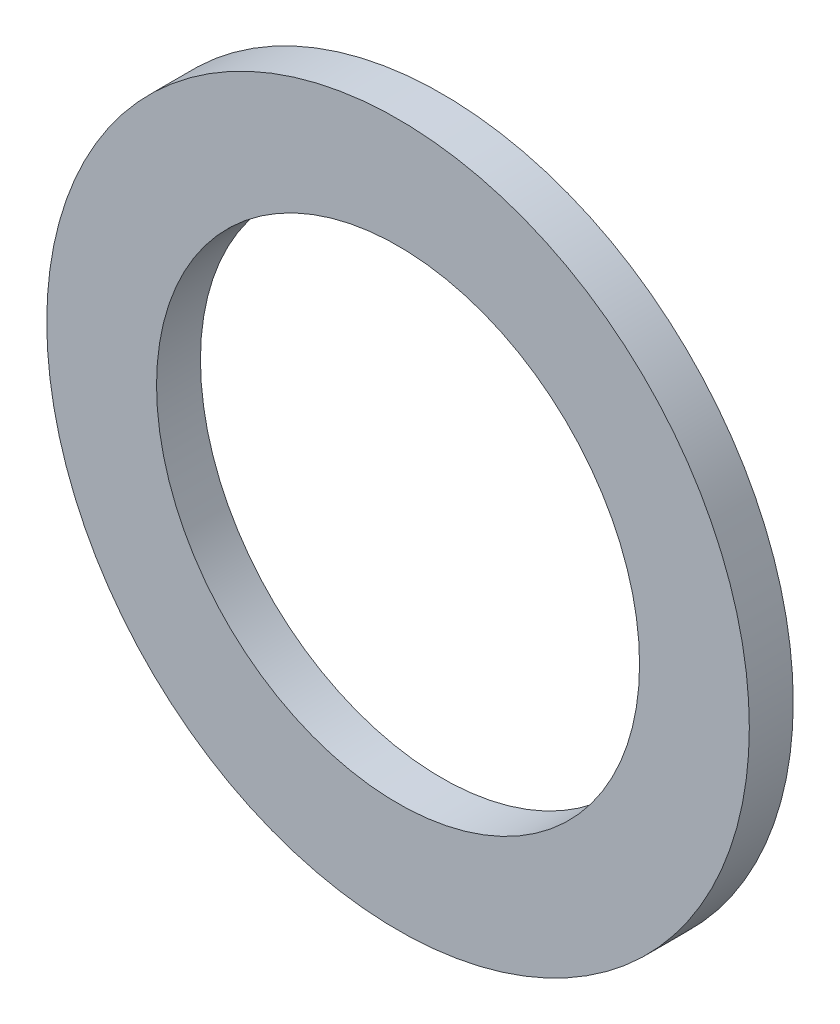
ISO-10303-21;
HEADER;
FILE_DESCRIPTION(('STEP AP214'),'2;1');
FILE_NAME('part.step','',(''),(''),'','','');
FILE_SCHEMA(('AUTOMOTIVE_DESIGN { 1 0 10303 214 1 1 1 1 }'));
ENDSEC;
DATA;
#1=APPLICATION_CONTEXT('core data for automotive mechanical design processes');
#2=APPLICATION_PROTOCOL_DEFINITION('international standard','automotive_design',2000,#1);
#3=PRODUCT_CONTEXT('',#1,'mechanical');
#4=PRODUCT('Part','Part','',(#3));
#5=PRODUCT_RELATED_PRODUCT_CATEGORY('part','',(#4));
#6=PRODUCT_DEFINITION_FORMATION('','',#4);
#7=PRODUCT_DEFINITION_CONTEXT('part definition',#1,'design');
#8=PRODUCT_DEFINITION('design','',#6,#7);
#9=PRODUCT_DEFINITION_SHAPE('','',#8);
#10=(LENGTH_UNIT() NAMED_UNIT(*) SI_UNIT(.MILLI.,.METRE.));
#11=(NAMED_UNIT(*) PLANE_ANGLE_UNIT() SI_UNIT($,.RADIAN.));
#12=(NAMED_UNIT(*) SI_UNIT($,.STERADIAN.) SOLID_ANGLE_UNIT());
#13=UNCERTAINTY_MEASURE_WITH_UNIT(LENGTH_MEASURE(1.E-05),#10,'distance_accuracy_value','');
#14=(GEOMETRIC_REPRESENTATION_CONTEXT(3) GLOBAL_UNCERTAINTY_ASSIGNED_CONTEXT((#13)) GLOBAL_UNIT_ASSIGNED_CONTEXT((#10,
#11,#12)) REPRESENTATION_CONTEXT('',''));
#15=CARTESIAN_POINT('',(0.,0.,0.));
#16=DIRECTION('',(0.,0.,1.));
#17=DIRECTION('',(1.,0.,0.));
#18=AXIS2_PLACEMENT_3D('',#15,#16,#17);
#19=CARTESIAN_POINT('',(0.,0.,1.));
#20=DIRECTION('',(0.,0.,1.));
#21=DIRECTION('',(1.,0.,0.));
#22=AXIS2_PLACEMENT_3D('',#19,#20,#21);
#23=PLANE('',#22);
#24=CARTESIAN_POINT('',(0.,0.,1.));
#25=DIRECTION('',(0.,0.,1.));
#26=DIRECTION('',(1.,0.,0.));
#27=AXIS2_PLACEMENT_3D('',#24,#25,#26);
#28=CIRCLE('',#27,8.);
#29=CARTESIAN_POINT('',(8.,0.,1.));
#30=VERTEX_POINT('',#29);
#31=EDGE_CURVE('E10',#30,#30,#28,.T.);
#32=ORIENTED_EDGE('',*,*,#31,.T.);
#33=EDGE_LOOP('',(#32));
#34=FACE_BOUND('',#33,.T.);
#35=CARTESIAN_POINT('',(0.,0.,1.));
#36=DIRECTION('',(0.,0.,1.));
#37=DIRECTION('',(1.,0.,0.));
#38=AXIS2_PLACEMENT_3D('',#35,#36,#37);
#39=CIRCLE('',#38,5.5);
#40=CARTESIAN_POINT('',(5.5,0.,1.));
#41=VERTEX_POINT('',#40);
#42=EDGE_CURVE('E42',#41,#41,#39,.T.);
#43=ORIENTED_EDGE('',*,*,#42,.F.);
#44=EDGE_LOOP('',(#43));
#45=FACE_BOUND('',#44,.T.);
#46=ADVANCED_FACE('F31',(#34,#45),#23,.T.);
#47=CARTESIAN_POINT('',(0.,0.,0.));
#48=DIRECTION('',(0.,0.,1.));
#49=DIRECTION('',(1.,0.,0.));
#50=AXIS2_PLACEMENT_3D('',#47,#48,#49);
#51=PLANE('',#50);
#52=CARTESIAN_POINT('',(0.,0.,0.));
#53=DIRECTION('',(0.,0.,1.));
#54=DIRECTION('',(1.,0.,0.));
#55=AXIS2_PLACEMENT_3D('',#52,#53,#54);
#56=CIRCLE('',#55,8.);
#57=CARTESIAN_POINT('',(8.,0.,0.));
#58=VERTEX_POINT('',#57);
#59=EDGE_CURVE('E35',#58,#58,#56,.T.);
#60=ORIENTED_EDGE('',*,*,#59,.F.);
#61=EDGE_LOOP('',(#60));
#62=FACE_BOUND('',#61,.T.);
#63=CARTESIAN_POINT('',(0.,0.,0.));
#64=DIRECTION('',(0.,0.,1.));
#65=DIRECTION('',(1.,0.,0.));
#66=AXIS2_PLACEMENT_3D('',#63,#64,#65);
#67=CIRCLE('',#66,5.5);
#68=CARTESIAN_POINT('',(5.5,0.,0.));
#69=VERTEX_POINT('',#68);
#70=EDGE_CURVE('E44',#69,#69,#67,.T.);
#71=ORIENTED_EDGE('',*,*,#70,.T.);
#72=EDGE_LOOP('',(#71));
#73=FACE_BOUND('',#72,.T.);
#74=ADVANCED_FACE('F54',(#62,#73),#51,.F.);
#75=CARTESIAN_POINT('',(0.,0.,1.));
#76=DIRECTION('',(0.,0.,-1.));
#77=DIRECTION('',(-1.,0.,0.));
#78=AXIS2_PLACEMENT_3D('',#75,#76,#77);
#79=CYLINDRICAL_SURFACE('',#78,8.);
#80=ORIENTED_EDGE('',*,*,#31,.F.);
#81=EDGE_LOOP('',(#80));
#82=FACE_BOUND('',#81,.T.);
#83=ORIENTED_EDGE('',*,*,#59,.T.);
#84=EDGE_LOOP('',(#83));
#85=FACE_BOUND('',#84,.T.);
#86=ADVANCED_FACE('F33',(#82,#85),#79,.T.);
#87=CARTESIAN_POINT('',(0.,0.,1.));
#88=DIRECTION('',(0.,0.,-1.));
#89=DIRECTION('',(-1.,0.,0.));
#90=AXIS2_PLACEMENT_3D('',#87,#88,#89);
#91=CYLINDRICAL_SURFACE('',#90,5.5);
#92=ORIENTED_EDGE('',*,*,#42,.T.);
#93=EDGE_LOOP('',(#92));
#94=FACE_BOUND('',#93,.T.);
#95=ORIENTED_EDGE('',*,*,#70,.F.);
#96=EDGE_LOOP('',(#95));
#97=FACE_BOUND('',#96,.T.);
#98=ADVANCED_FACE('F50',(#94,#97),#91,.F.);
#99=CLOSED_SHELL('',(#46,#74,#86,#98));
#100=MANIFOLD_SOLID_BREP('B2',#99);
#101=ADVANCED_BREP_SHAPE_REPRESENTATION('',(#18,#100),#14);
#102=SHAPE_DEFINITION_REPRESENTATION(#9,#101);
ENDSEC;
END-ISO-10303-21;
